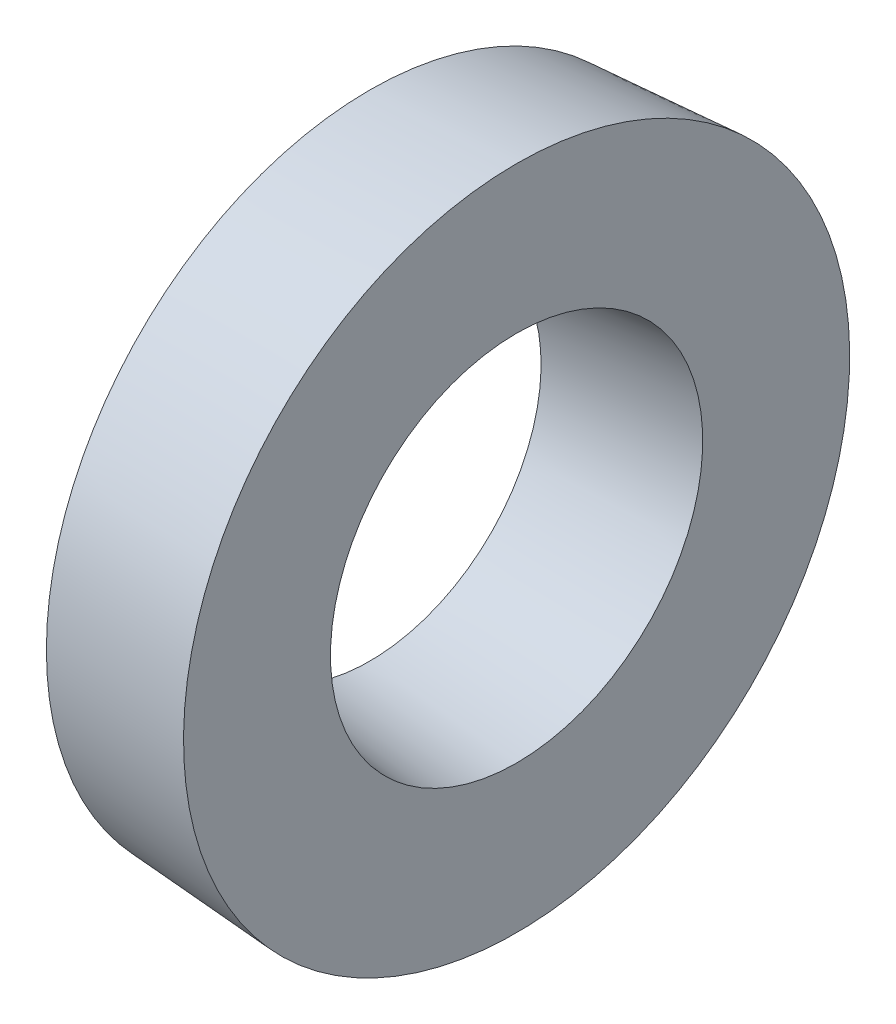
ISO-10303-21;
HEADER;
FILE_DESCRIPTION(('STEP AP214'),'2;1');
FILE_NAME('part.step','',(''),(''),'','','');
FILE_SCHEMA(('AUTOMOTIVE_DESIGN { 1 0 10303 214 1 1 1 1 }'));
ENDSEC;
DATA;
#1=APPLICATION_CONTEXT('core data for automotive mechanical design processes');
#2=APPLICATION_PROTOCOL_DEFINITION('international standard','automotive_design',2000,#1);
#3=PRODUCT_CONTEXT('',#1,'mechanical');
#4=PRODUCT('Part','Part','',(#3));
#5=PRODUCT_RELATED_PRODUCT_CATEGORY('part','',(#4));
#6=PRODUCT_DEFINITION_FORMATION('','',#4);
#7=PRODUCT_DEFINITION_CONTEXT('part definition',#1,'design');
#8=PRODUCT_DEFINITION('design','',#6,#7);
#9=PRODUCT_DEFINITION_SHAPE('','',#8);
#10=(LENGTH_UNIT() NAMED_UNIT(*) SI_UNIT(.MILLI.,.METRE.));
#11=(NAMED_UNIT(*) PLANE_ANGLE_UNIT() SI_UNIT($,.RADIAN.));
#12=(NAMED_UNIT(*) SI_UNIT($,.STERADIAN.) SOLID_ANGLE_UNIT());
#13=UNCERTAINTY_MEASURE_WITH_UNIT(LENGTH_MEASURE(1.E-05),#10,'distance_accuracy_value','');
#14=(GEOMETRIC_REPRESENTATION_CONTEXT(3) GLOBAL_UNCERTAINTY_ASSIGNED_CONTEXT((#13)) GLOBAL_UNIT_ASSIGNED_CONTEXT((#10,
#11,#12)) REPRESENTATION_CONTEXT('',''));
#15=CARTESIAN_POINT('',(0.,0.,0.));
#16=DIRECTION('',(0.,0.,1.));
#17=DIRECTION('',(1.,0.,0.));
#18=AXIS2_PLACEMENT_3D('',#15,#16,#17);
#19=CARTESIAN_POINT('',(3400.,0.,0.));
#20=DIRECTION('',(1.,0.,0.));
#21=DIRECTION('',(0.,0.,-1.));
#22=AXIS2_PLACEMENT_3D('',#19,#20,#21);
#23=CONICAL_SURFACE('',#22,350.,0.099668652491162);
#24=CARTESIAN_POINT('',(3400.,0.,0.));
#25=DIRECTION('',(-1.,0.,0.));
#26=DIRECTION('',(0.,0.,1.));
#27=AXIS2_PLACEMENT_3D('',#24,#25,#26);
#28=CIRCLE('',#27,350.);
#29=CARTESIAN_POINT('',(3400.,350.,-2.51285512088913E-06));
#30=VERTEX_POINT('',#29);
#31=CARTESIAN_POINT('',(3400.,350.,0.));
#32=VERTEX_POINT('',#31);
#33=EDGE_CURVE('E11',#30,#32,#28,.T.);
#34=ORIENTED_EDGE('',*,*,#33,.T.);
#35=DIRECTION('',(0.995037190209989,0.0995037190209989,0.));
#36=VECTOR('',#35,1.);
#37=CARTESIAN_POINT('',(3700.,380.,0.));
#38=LINE('',#37,#36);
#39=CARTESIAN_POINT('',(3700.,380.,0.));
#40=VERTEX_POINT('',#39);
#41=EDGE_CURVE('E100',#32,#40,#38,.T.);
#42=ORIENTED_EDGE('',*,*,#41,.T.);
#43=CARTESIAN_POINT('',(3700.,0.,0.));
#44=DIRECTION('',(-1.,0.,0.));
#45=DIRECTION('',(0.,0.,1.));
#46=AXIS2_PLACEMENT_3D('',#43,#44,#45);
#47=CIRCLE('',#46,380.);
#48=CARTESIAN_POINT('',(3700.,380.,-2.72824270267963E-06));
#49=VERTEX_POINT('',#48);
#50=EDGE_CURVE('E80',#49,#40,#47,.T.);
#51=ORIENTED_EDGE('',*,*,#50,.F.);
#52=DIRECTION('',(0.995037190209989,0.0995037190209989,-7.143955139698E-10));
#53=VECTOR('',#52,1.);
#54=CARTESIAN_POINT('',(3700.,380.,-2.72824270267963E-06));
#55=LINE('',#54,#53);
#56=EDGE_CURVE('E103',#30,#49,#55,.T.);
#57=ORIENTED_EDGE('',*,*,#56,.F.);
#58=EDGE_LOOP('',(#34,#42,#51,#57));
#59=FACE_BOUND('',#58,.T.);
#60=ADVANCED_FACE('F39',(#59),#23,.F.);
#61=CARTESIAN_POINT('',(3400.,350.,-2.51285512088913E-06));
#62=DIRECTION('',(1.,0.,0.));
#63=DIRECTION('',(0.,0.,-1.));
#64=AXIS2_PLACEMENT_3D('',#61,#62,#63);
#65=PLANE('',#64);
#66=CARTESIAN_POINT('',(3400.,0.,0.));
#67=DIRECTION('',(-1.,0.,0.));
#68=DIRECTION('',(0.,0.,1.));
#69=AXIS2_PLACEMENT_3D('',#66,#67,#68);
#70=CIRCLE('',#69,660.);
#71=CARTESIAN_POINT('',(3400.,660.,-4.73852679939093E-06));
#72=VERTEX_POINT('',#71);
#73=CARTESIAN_POINT('',(3400.,660.,0.));
#74=VERTEX_POINT('',#73);
#75=EDGE_CURVE('E50',#72,#74,#70,.T.);
#76=ORIENTED_EDGE('',*,*,#75,.T.);
#77=DIRECTION('',(0.,-1.,0.));
#78=VECTOR('',#77,1.);
#79=CARTESIAN_POINT('',(3400.,350.,0.));
#80=LINE('',#79,#78);
#81=EDGE_CURVE('E104',#74,#32,#80,.T.);
#82=ORIENTED_EDGE('',*,*,#81,.T.);
#83=ORIENTED_EDGE('',*,*,#33,.F.);
#84=DIRECTION('',(0.,-1.,7.17958605968322E-09));
#85=VECTOR('',#84,1.);
#86=CARTESIAN_POINT('',(3400.,350.,-2.51285512088913E-06));
#87=LINE('',#86,#85);
#88=EDGE_CURVE('E91',#72,#30,#87,.T.);
#89=ORIENTED_EDGE('',*,*,#88,.F.);
#90=EDGE_LOOP('',(#76,#82,#83,#89));
#91=FACE_BOUND('',#90,.T.);
#92=ADVANCED_FACE('F41',(#91),#65,.F.);
#93=CARTESIAN_POINT('',(3700.,0.,0.));
#94=DIRECTION('',(1.,0.,0.));
#95=DIRECTION('',(0.,0.,-1.));
#96=AXIS2_PLACEMENT_3D('',#93,#94,#95);
#97=CONICAL_SURFACE('',#96,680.,0.0665681637758238);
#98=CARTESIAN_POINT('',(3700.,0.,0.));
#99=DIRECTION('',(-1.,0.,0.));
#100=DIRECTION('',(0.,0.,1.));
#101=AXIS2_PLACEMENT_3D('',#98,#99,#100);
#102=CIRCLE('',#101,680.);
#103=CARTESIAN_POINT('',(3700.,680.,-4.88211852058459E-06));
#104=VERTEX_POINT('',#103);
#105=CARTESIAN_POINT('',(3700.,680.,0.));
#106=VERTEX_POINT('',#105);
#107=EDGE_CURVE('E89',#104,#106,#102,.T.);
#108=ORIENTED_EDGE('',*,*,#107,.T.);
#109=DIRECTION('',(-0.997785157856609,-0.0665190105237739,0.));
#110=VECTOR('',#109,1.);
#111=CARTESIAN_POINT('',(3400.,660.,0.));
#112=LINE('',#111,#110);
#113=EDGE_CURVE('E97',#106,#74,#112,.T.);
#114=ORIENTED_EDGE('',*,*,#113,.T.);
#115=ORIENTED_EDGE('',*,*,#75,.F.);
#116=DIRECTION('',(-0.997785157856609,-0.0665190105237739,4.77578960660409E-10));
#117=VECTOR('',#116,1.);
#118=CARTESIAN_POINT('',(3400.,660.,-4.73852679939093E-06));
#119=LINE('',#118,#117);
#120=EDGE_CURVE('E109',#104,#72,#119,.T.);
#121=ORIENTED_EDGE('',*,*,#120,.F.);
#122=EDGE_LOOP('',(#108,#114,#115,#121));
#123=FACE_BOUND('',#122,.T.);
#124=ADVANCED_FACE('F112',(#123),#97,.T.);
#125=CARTESIAN_POINT('',(3700.,680.,-4.88211852058459E-06));
#126=DIRECTION('',(-1.,0.,0.));
#127=DIRECTION('',(0.,0.,1.));
#128=AXIS2_PLACEMENT_3D('',#125,#126,#127);
#129=PLANE('',#128);
#130=DIRECTION('',(0.,1.,-7.17958605968322E-09));
#131=VECTOR('',#130,1.);
#132=CARTESIAN_POINT('',(3700.,680.,-4.88211852058459E-06));
#133=LINE('',#132,#131);
#134=EDGE_CURVE('E82',#49,#104,#133,.T.);
#135=ORIENTED_EDGE('',*,*,#134,.F.);
#136=ORIENTED_EDGE('',*,*,#50,.T.);
#137=DIRECTION('',(0.,1.,0.));
#138=VECTOR('',#137,1.);
#139=CARTESIAN_POINT('',(3700.,680.,0.));
#140=LINE('',#139,#138);
#141=EDGE_CURVE('E85',#40,#106,#140,.T.);
#142=ORIENTED_EDGE('',*,*,#141,.T.);
#143=ORIENTED_EDGE('',*,*,#107,.F.);
#144=EDGE_LOOP('',(#135,#136,#142,#143));
#145=FACE_BOUND('',#144,.T.);
#146=ADVANCED_FACE('F83',(#145),#129,.F.);
#147=CARTESIAN_POINT('',(0.,0.,0.));
#148=DIRECTION('',(0.,-7.17958605968322E-09,-1.));
#149=DIRECTION('',(-1.,0.,0.));
#150=AXIS2_PLACEMENT_3D('',#147,#148,#149);
#151=PLANE('',#150);
#152=ORIENTED_EDGE('',*,*,#56,.T.);
#153=ORIENTED_EDGE('',*,*,#134,.T.);
#154=ORIENTED_EDGE('',*,*,#120,.T.);
#155=ORIENTED_EDGE('',*,*,#88,.T.);
#156=EDGE_LOOP('',(#152,#153,#154,#155));
#157=FACE_BOUND('',#156,.T.);
#158=ADVANCED_FACE('F111',(#157),#151,.F.);
#159=CARTESIAN_POINT('',(0.,0.,0.));
#160=DIRECTION('',(0.,0.,-1.));
#161=DIRECTION('',(-1.,0.,0.));
#162=AXIS2_PLACEMENT_3D('',#159,#160,#161);
#163=PLANE('',#162);
#164=ORIENTED_EDGE('',*,*,#41,.F.);
#165=ORIENTED_EDGE('',*,*,#81,.F.);
#166=ORIENTED_EDGE('',*,*,#113,.F.);
#167=ORIENTED_EDGE('',*,*,#141,.F.);
#168=EDGE_LOOP('',(#164,#165,#166,#167));
#169=FACE_BOUND('',#168,.T.);
#170=ADVANCED_FACE('F94',(#169),#163,.T.);
#171=CLOSED_SHELL('',(#60,#92,#124,#146,#158,#170));
#172=MANIFOLD_SOLID_BREP('B2',#171);
#173=ADVANCED_BREP_SHAPE_REPRESENTATION('',(#18,#172),#14);
#174=SHAPE_DEFINITION_REPRESENTATION(#9,#173);
ENDSEC;
END-ISO-10303-21;
